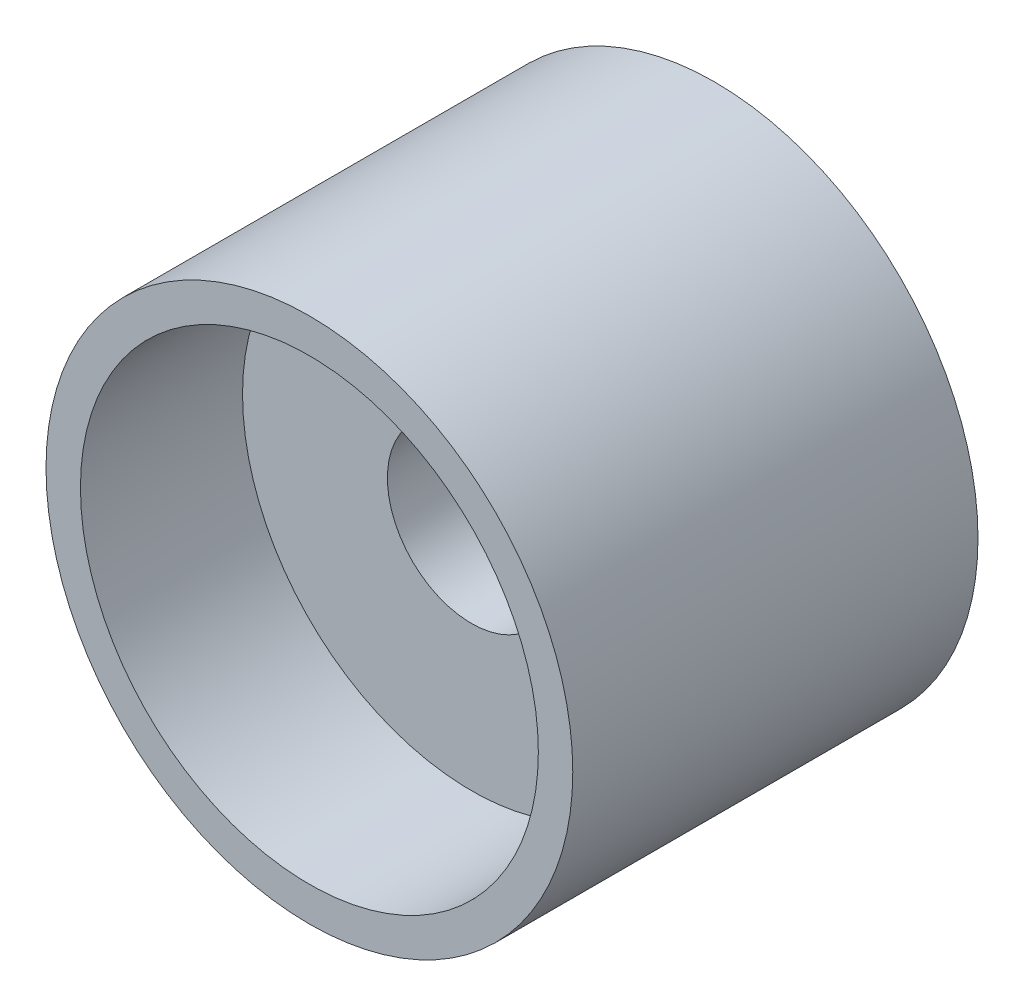
ISO-10303-21;
HEADER;
FILE_DESCRIPTION(('STEP AP214'),'2;1');
FILE_NAME('part.step','',(''),(''),'','','');
FILE_SCHEMA(('AUTOMOTIVE_DESIGN { 1 0 10303 214 1 1 1 1 }'));
ENDSEC;
DATA;
#1=APPLICATION_CONTEXT('core data for automotive mechanical design processes');
#2=APPLICATION_PROTOCOL_DEFINITION('international standard','automotive_design',2000,#1);
#3=PRODUCT_CONTEXT('',#1,'mechanical');
#4=PRODUCT('Part','Part','',(#3));
#5=PRODUCT_RELATED_PRODUCT_CATEGORY('part','',(#4));
#6=PRODUCT_DEFINITION_FORMATION('','',#4);
#7=PRODUCT_DEFINITION_CONTEXT('part definition',#1,'design');
#8=PRODUCT_DEFINITION('design','',#6,#7);
#9=PRODUCT_DEFINITION_SHAPE('','',#8);
#10=(LENGTH_UNIT() NAMED_UNIT(*) SI_UNIT(.MILLI.,.METRE.));
#11=(NAMED_UNIT(*) PLANE_ANGLE_UNIT() SI_UNIT($,.RADIAN.));
#12=(NAMED_UNIT(*) SI_UNIT($,.STERADIAN.) SOLID_ANGLE_UNIT());
#13=UNCERTAINTY_MEASURE_WITH_UNIT(LENGTH_MEASURE(1.E-05),#10,'distance_accuracy_value','');
#14=(GEOMETRIC_REPRESENTATION_CONTEXT(3) GLOBAL_UNCERTAINTY_ASSIGNED_CONTEXT((#13)) GLOBAL_UNIT_ASSIGNED_CONTEXT((#10,
#11,#12)) REPRESENTATION_CONTEXT('',''));
#15=CARTESIAN_POINT('',(0.,0.,0.));
#16=DIRECTION('',(0.,0.,1.));
#17=DIRECTION('',(1.,0.,0.));
#18=AXIS2_PLACEMENT_3D('',#15,#16,#17);
#19=CARTESIAN_POINT('',(0.,0.,20.));
#20=DIRECTION('',(0.,0.,-1.));
#21=DIRECTION('',(-1.,0.,0.));
#22=AXIS2_PLACEMENT_3D('',#19,#20,#21);
#23=CYLINDRICAL_SURFACE('',#22,4.15);
#24=CARTESIAN_POINT('',(0.,0.,0.));
#25=DIRECTION('',(0.,0.,1.));
#26=DIRECTION('',(1.,0.,0.));
#27=AXIS2_PLACEMENT_3D('',#24,#25,#26);
#28=CIRCLE('',#27,4.15);
#29=CARTESIAN_POINT('',(4.15,0.,0.));
#30=VERTEX_POINT('',#29);
#31=EDGE_CURVE('E44',#30,#30,#28,.T.);
#32=ORIENTED_EDGE('',*,*,#31,.F.);
#33=EDGE_LOOP('',(#32));
#34=FACE_BOUND('',#33,.T.);
#35=CARTESIAN_POINT('',(0.,0.,12.));
#36=DIRECTION('',(0.,0.,1.));
#37=DIRECTION('',(1.,0.,0.));
#38=AXIS2_PLACEMENT_3D('',#35,#36,#37);
#39=CIRCLE('',#38,4.15);
#40=CARTESIAN_POINT('',(4.15,0.,12.));
#41=VERTEX_POINT('',#40);
#42=EDGE_CURVE('E35',#41,#41,#39,.T.);
#43=ORIENTED_EDGE('',*,*,#42,.T.);
#44=EDGE_LOOP('',(#43));
#45=FACE_BOUND('',#44,.T.);
#46=ADVANCED_FACE('F31',(#34,#45),#23,.F.);
#47=CARTESIAN_POINT('',(0.,0.,20.));
#48=DIRECTION('',(0.,0.,1.));
#49=DIRECTION('',(1.,0.,0.));
#50=AXIS2_PLACEMENT_3D('',#47,#48,#49);
#51=PLANE('',#50);
#52=CARTESIAN_POINT('',(0.,0.,20.));
#53=DIRECTION('',(0.,0.,1.));
#54=DIRECTION('',(1.,0.,0.));
#55=AXIS2_PLACEMENT_3D('',#52,#53,#54);
#56=CIRCLE('',#55,11.3);
#57=CARTESIAN_POINT('',(11.3,0.,20.));
#58=VERTEX_POINT('',#57);
#59=EDGE_CURVE('E48',#58,#58,#56,.T.);
#60=ORIENTED_EDGE('',*,*,#59,.F.);
#61=EDGE_LOOP('',(#60));
#62=FACE_BOUND('',#61,.T.);
#63=CARTESIAN_POINT('',(0.,0.,20.));
#64=DIRECTION('',(0.,0.,1.));
#65=DIRECTION('',(1.,0.,0.));
#66=AXIS2_PLACEMENT_3D('',#63,#64,#65);
#67=CIRCLE('',#66,13.);
#68=CARTESIAN_POINT('',(13.,0.,20.));
#69=VERTEX_POINT('',#68);
#70=EDGE_CURVE('E10',#69,#69,#67,.T.);
#71=ORIENTED_EDGE('',*,*,#70,.T.);
#72=EDGE_LOOP('',(#71));
#73=FACE_BOUND('',#72,.T.);
#74=ADVANCED_FACE('F69',(#62,#73),#51,.T.);
#75=CARTESIAN_POINT('',(0.,0.,0.));
#76=DIRECTION('',(0.,0.,1.));
#77=DIRECTION('',(1.,0.,0.));
#78=AXIS2_PLACEMENT_3D('',#75,#76,#77);
#79=PLANE('',#78);
#80=CARTESIAN_POINT('',(0.,0.,0.));
#81=DIRECTION('',(0.,0.,1.));
#82=DIRECTION('',(1.,0.,0.));
#83=AXIS2_PLACEMENT_3D('',#80,#81,#82);
#84=CIRCLE('',#83,13.);
#85=CARTESIAN_POINT('',(13.,0.,0.));
#86=VERTEX_POINT('',#85);
#87=EDGE_CURVE('E39',#86,#86,#84,.T.);
#88=ORIENTED_EDGE('',*,*,#87,.F.);
#89=EDGE_LOOP('',(#88));
#90=FACE_BOUND('',#89,.T.);
#91=ORIENTED_EDGE('',*,*,#31,.T.);
#92=EDGE_LOOP('',(#91));
#93=FACE_BOUND('',#92,.T.);
#94=ADVANCED_FACE('F75',(#90,#93),#79,.F.);
#95=CARTESIAN_POINT('',(0.,0.,20.));
#96=DIRECTION('',(0.,0.,-1.));
#97=DIRECTION('',(-1.,0.,0.));
#98=AXIS2_PLACEMENT_3D('',#95,#96,#97);
#99=CYLINDRICAL_SURFACE('',#98,13.);
#100=ORIENTED_EDGE('',*,*,#70,.F.);
#101=EDGE_LOOP('',(#100));
#102=FACE_BOUND('',#101,.T.);
#103=ORIENTED_EDGE('',*,*,#87,.T.);
#104=EDGE_LOOP('',(#103));
#105=FACE_BOUND('',#104,.T.);
#106=ADVANCED_FACE('F33',(#102,#105),#99,.T.);
#107=CARTESIAN_POINT('',(0.,0.,12.));
#108=DIRECTION('',(0.,0.,1.));
#109=DIRECTION('',(1.,0.,0.));
#110=AXIS2_PLACEMENT_3D('',#107,#108,#109);
#111=CYLINDRICAL_SURFACE('',#110,11.3);
#112=CARTESIAN_POINT('',(0.,0.,12.));
#113=DIRECTION('',(0.,0.,1.));
#114=DIRECTION('',(1.,0.,0.));
#115=AXIS2_PLACEMENT_3D('',#112,#113,#114);
#116=CIRCLE('',#115,11.3);
#117=CARTESIAN_POINT('',(11.3,0.,12.));
#118=VERTEX_POINT('',#117);
#119=EDGE_CURVE('E51',#118,#118,#116,.T.);
#120=ORIENTED_EDGE('',*,*,#119,.F.);
#121=EDGE_LOOP('',(#120));
#122=FACE_BOUND('',#121,.T.);
#123=ORIENTED_EDGE('',*,*,#59,.T.);
#124=EDGE_LOOP('',(#123));
#125=FACE_BOUND('',#124,.T.);
#126=ADVANCED_FACE('F61',(#122,#125),#111,.F.);
#127=CARTESIAN_POINT('',(0.,0.,12.));
#128=DIRECTION('',(0.,0.,1.));
#129=DIRECTION('',(1.,0.,0.));
#130=AXIS2_PLACEMENT_3D('',#127,#128,#129);
#131=PLANE('',#130);
#132=ORIENTED_EDGE('',*,*,#42,.F.);
#133=EDGE_LOOP('',(#132));
#134=FACE_BOUND('',#133,.T.);
#135=ORIENTED_EDGE('',*,*,#119,.T.);
#136=EDGE_LOOP('',(#135));
#137=FACE_BOUND('',#136,.T.);
#138=ADVANCED_FACE('F59',(#134,#137),#131,.T.);
#139=CLOSED_SHELL('',(#46,#74,#94,#106,#126,#138));
#140=MANIFOLD_SOLID_BREP('B2',#139);
#141=ADVANCED_BREP_SHAPE_REPRESENTATION('',(#18,#140),#14);
#142=SHAPE_DEFINITION_REPRESENTATION(#9,#141);
ENDSEC;
END-ISO-10303-21;
